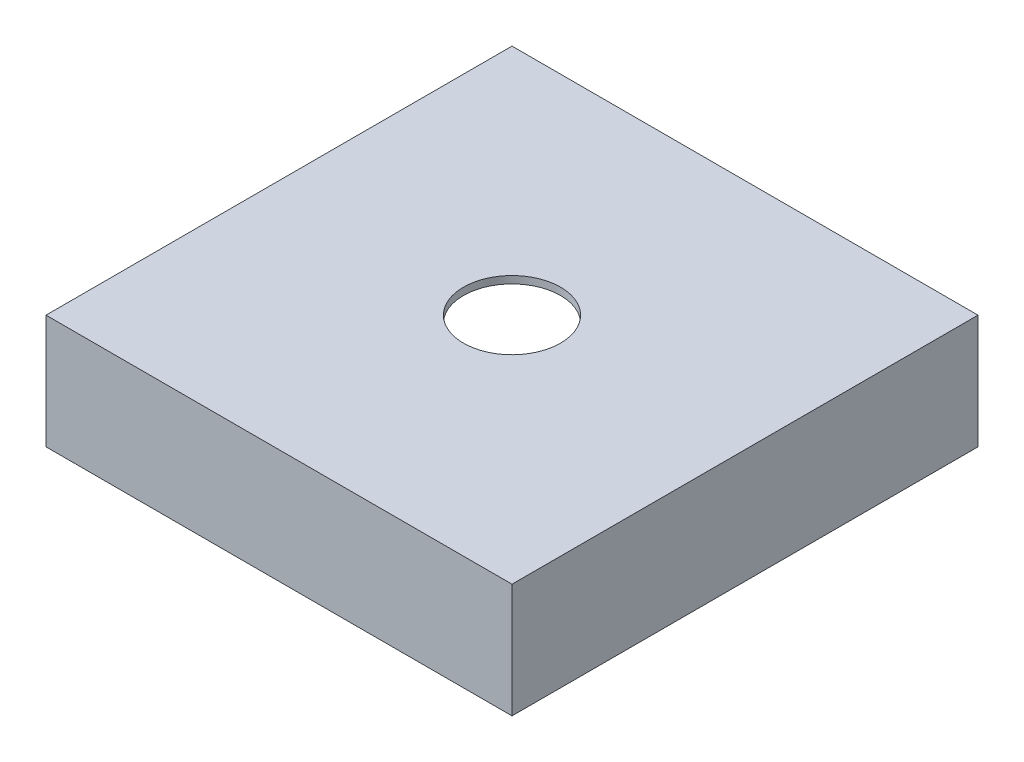
ISO-10303-21;
HEADER;
FILE_DESCRIPTION(('STEP AP214'),'2;1');
FILE_NAME('part.step','',(''),(''),'','','');
FILE_SCHEMA(('AUTOMOTIVE_DESIGN { 1 0 10303 214 1 1 1 1 }'));
ENDSEC;
DATA;
#1=APPLICATION_CONTEXT('core data for automotive mechanical design processes');
#2=APPLICATION_PROTOCOL_DEFINITION('international standard','automotive_design',2000,#1);
#3=PRODUCT_CONTEXT('',#1,'mechanical');
#4=PRODUCT('Part','Part','',(#3));
#5=PRODUCT_RELATED_PRODUCT_CATEGORY('part','',(#4));
#6=PRODUCT_DEFINITION_FORMATION('','',#4);
#7=PRODUCT_DEFINITION_CONTEXT('part definition',#1,'design');
#8=PRODUCT_DEFINITION('design','',#6,#7);
#9=PRODUCT_DEFINITION_SHAPE('','',#8);
#10=(LENGTH_UNIT() NAMED_UNIT(*) SI_UNIT(.MILLI.,.METRE.));
#11=(NAMED_UNIT(*) PLANE_ANGLE_UNIT() SI_UNIT($,.RADIAN.));
#12=(NAMED_UNIT(*) SI_UNIT($,.STERADIAN.) SOLID_ANGLE_UNIT());
#13=UNCERTAINTY_MEASURE_WITH_UNIT(LENGTH_MEASURE(1.E-05),#10,'distance_accuracy_value','');
#14=(GEOMETRIC_REPRESENTATION_CONTEXT(3) GLOBAL_UNCERTAINTY_ASSIGNED_CONTEXT((#13)) GLOBAL_UNIT_ASSIGNED_CONTEXT((#10,
#11,#12)) REPRESENTATION_CONTEXT('',''));
#15=CARTESIAN_POINT('',(0.,0.,0.));
#16=DIRECTION('',(0.,0.,1.));
#17=DIRECTION('',(1.,0.,0.));
#18=AXIS2_PLACEMENT_3D('',#15,#16,#17);
#19=CARTESIAN_POINT('',(0.,9.525,0.));
#20=DIRECTION('',(0.,1.,0.));
#21=DIRECTION('',(0.,0.,1.));
#22=AXIS2_PLACEMENT_3D('',#19,#20,#21);
#23=PLANE('',#22);
#24=DIRECTION('',(0.,0.,1.));
#25=VECTOR('',#24,1.);
#26=CARTESIAN_POINT('',(1589.69897269002,9.525,285.548674534386));
#27=LINE('',#26,#25);
#28=CARTESIAN_POINT('',(1589.69897269002,9.525,285.548674534386));
#29=VERTEX_POINT('',#28);
#30=CARTESIAN_POINT('',(1589.69897269002,9.525,895.148674534385));
#31=VERTEX_POINT('',#30);
#32=EDGE_CURVE('E160',#29,#31,#27,.T.);
#33=ORIENTED_EDGE('',*,*,#32,.T.);
#34=DIRECTION('',(1.,0.,0.));
#35=VECTOR('',#34,1.);
#36=CARTESIAN_POINT('',(1589.69897269002,9.525,895.148674534385));
#37=LINE('',#36,#35);
#38=CARTESIAN_POINT('',(2199.29897269002,9.525,895.148674534385));
#39=VERTEX_POINT('',#38);
#40=EDGE_CURVE('E165',#31,#39,#37,.T.);
#41=ORIENTED_EDGE('',*,*,#40,.T.);
#42=DIRECTION('',(0.,0.,-1.));
#43=VECTOR('',#42,1.);
#44=CARTESIAN_POINT('',(2199.29897269002,9.525,285.548674534386));
#45=LINE('',#44,#43);
#46=CARTESIAN_POINT('',(2199.29897269002,9.525,285.548674534386));
#47=VERTEX_POINT('',#46);
#48=EDGE_CURVE('E167',#39,#47,#45,.T.);
#49=ORIENTED_EDGE('',*,*,#48,.T.);
#50=DIRECTION('',(-1.,0.,0.));
#51=VECTOR('',#50,1.);
#52=CARTESIAN_POINT('',(1589.69897269002,9.525,285.548674534386));
#53=LINE('',#52,#51);
#54=EDGE_CURVE('E169',#47,#29,#53,.T.);
#55=ORIENTED_EDGE('',*,*,#54,.T.);
#56=EDGE_LOOP('',(#33,#41,#49,#55));
#57=FACE_BOUND('',#56,.T.);
#58=CARTESIAN_POINT('',(1894.49897269002,9.525,590.348674534386));
#59=DIRECTION('',(0.,1.,0.));
#60=DIRECTION('',(0.,0.,1.));
#61=AXIS2_PLACEMENT_3D('',#58,#59,#60);
#62=CIRCLE('',#61,63.4999999999998);
#63=CARTESIAN_POINT('',(1894.49897269002,9.525,526.848674534386));
#64=VERTEX_POINT('',#63);
#65=EDGE_CURVE('E157',#64,#64,#62,.T.);
#66=ORIENTED_EDGE('',*,*,#65,.F.);
#67=EDGE_LOOP('',(#66));
#68=FACE_BOUND('',#67,.T.);
#69=ADVANCED_FACE('F43',(#57,#68),#23,.T.);
#70=CARTESIAN_POINT('',(0.,0.,0.));
#71=DIRECTION('',(0.,1.,0.));
#72=DIRECTION('',(0.,0.,1.));
#73=AXIS2_PLACEMENT_3D('',#70,#71,#72);
#74=PLANE('',#73);
#75=DIRECTION('',(-1.,0.,0.));
#76=VECTOR('',#75,1.);
#77=CARTESIAN_POINT('',(3.77241165729674E-12,0.,323.648674534408));
#78=LINE('',#77,#76);
#79=CARTESIAN_POINT('',(2161.19897269002,0.,323.648674534383));
#80=VERTEX_POINT('',#79);
#81=CARTESIAN_POINT('',(1627.79897269002,0.,323.648674534386));
#82=VERTEX_POINT('',#81);
#83=EDGE_CURVE('E58',#80,#82,#78,.T.);
#84=ORIENTED_EDGE('',*,*,#83,.F.);
#85=DIRECTION('',(0.,0.,1.));
#86=VECTOR('',#85,1.);
#87=CARTESIAN_POINT('',(2161.19897269002,0.,-1.57441788732066E-11));
#88=LINE('',#87,#86);
#89=CARTESIAN_POINT('',(2161.19897269002,0.,857.048674534384));
#90=VERTEX_POINT('',#89);
#91=EDGE_CURVE('E111',#80,#90,#88,.T.);
#92=ORIENTED_EDGE('',*,*,#91,.T.);
#93=DIRECTION('',(1.,0.,0.));
#94=VECTOR('',#93,1.);
#95=CARTESIAN_POINT('',(3.32988686506581E-12,0.,857.048674534393));
#96=LINE('',#95,#94);
#97=CARTESIAN_POINT('',(1627.79897269002,0.,857.048674534386));
#98=VERTEX_POINT('',#97);
#99=EDGE_CURVE('E129',#98,#90,#96,.T.);
#100=ORIENTED_EDGE('',*,*,#99,.F.);
#101=DIRECTION('',(0.,0.,1.));
#102=VECTOR('',#101,1.);
#103=CARTESIAN_POINT('',(1627.79897269002,0.,0.));
#104=LINE('',#103,#102);
#105=EDGE_CURVE('E63',#82,#98,#104,.T.);
#106=ORIENTED_EDGE('',*,*,#105,.F.);
#107=EDGE_LOOP('',(#84,#92,#100,#106));
#108=FACE_BOUND('',#107,.T.);
#109=CARTESIAN_POINT('',(1894.49897269002,0.,590.348674534386));
#110=DIRECTION('',(0.,1.,0.));
#111=DIRECTION('',(0.,0.,1.));
#112=AXIS2_PLACEMENT_3D('',#109,#110,#111);
#113=CIRCLE('',#112,63.4999999999998);
#114=CARTESIAN_POINT('',(1894.49897269002,0.,526.848674534386));
#115=VERTEX_POINT('',#114);
#116=EDGE_CURVE('E113',#115,#115,#113,.T.);
#117=ORIENTED_EDGE('',*,*,#116,.T.);
#118=EDGE_LOOP('',(#117));
#119=FACE_BOUND('',#118,.T.);
#120=ADVANCED_FACE('F195',(#108,#119),#74,.F.);
#121=CARTESIAN_POINT('',(1589.69897269002,9.525,285.548674534386));
#122=DIRECTION('',(1.,0.,0.));
#123=DIRECTION('',(0.,0.,-1.));
#124=AXIS2_PLACEMENT_3D('',#121,#122,#123);
#125=PLANE('',#124);
#126=DIRECTION('',(0.,-1.,0.));
#127=VECTOR('',#126,1.);
#128=CARTESIAN_POINT('',(1589.69897269002,9.525,285.548674534386));
#129=LINE('',#128,#127);
#130=CARTESIAN_POINT('',(1589.69897269002,-139.7,285.548674534386));
#131=VERTEX_POINT('',#130);
#132=EDGE_CURVE('E171',#29,#131,#129,.T.);
#133=ORIENTED_EDGE('',*,*,#132,.T.);
#134=DIRECTION('',(0.,0.,-1.));
#135=VECTOR('',#134,1.);
#136=CARTESIAN_POINT('',(1589.69897269002,-139.7,0.));
#137=LINE('',#136,#135);
#138=CARTESIAN_POINT('',(1589.69897269002,-139.7,895.148674534385));
#139=VERTEX_POINT('',#138);
#140=EDGE_CURVE('E139',#139,#131,#137,.T.);
#141=ORIENTED_EDGE('',*,*,#140,.F.);
#142=DIRECTION('',(0.,-1.,0.));
#143=VECTOR('',#142,1.);
#144=CARTESIAN_POINT('',(1589.69897269002,9.525,895.148674534385));
#145=LINE('',#144,#143);
#146=EDGE_CURVE('E11',#31,#139,#145,.T.);
#147=ORIENTED_EDGE('',*,*,#146,.F.);
#148=ORIENTED_EDGE('',*,*,#32,.F.);
#149=EDGE_LOOP('',(#133,#141,#147,#148));
#150=FACE_BOUND('',#149,.T.);
#151=ADVANCED_FACE('F45',(#150),#125,.F.);
#152=CARTESIAN_POINT('',(1589.69897269002,9.525,895.148674534385));
#153=DIRECTION('',(0.,0.,-1.));
#154=DIRECTION('',(-1.,0.,0.));
#155=AXIS2_PLACEMENT_3D('',#152,#153,#154);
#156=PLANE('',#155);
#157=ORIENTED_EDGE('',*,*,#146,.T.);
#158=DIRECTION('',(-1.,0.,0.));
#159=VECTOR('',#158,1.);
#160=CARTESIAN_POINT('',(0.,-139.7,895.148674534385));
#161=LINE('',#160,#159);
#162=CARTESIAN_POINT('',(2199.29897269002,-139.7,895.148674534385));
#163=VERTEX_POINT('',#162);
#164=EDGE_CURVE('E136',#163,#139,#161,.T.);
#165=ORIENTED_EDGE('',*,*,#164,.F.);
#166=DIRECTION('',(0.,-1.,0.));
#167=VECTOR('',#166,1.);
#168=CARTESIAN_POINT('',(2199.29897269002,9.525,895.148674534385));
#169=LINE('',#168,#167);
#170=EDGE_CURVE('E51',#39,#163,#169,.T.);
#171=ORIENTED_EDGE('',*,*,#170,.F.);
#172=ORIENTED_EDGE('',*,*,#40,.F.);
#173=EDGE_LOOP('',(#157,#165,#171,#172));
#174=FACE_BOUND('',#173,.T.);
#175=ADVANCED_FACE('F183',(#174),#156,.F.);
#176=CARTESIAN_POINT('',(2199.29897269002,9.525,285.548674534386));
#177=DIRECTION('',(-1.,0.,0.));
#178=DIRECTION('',(0.,0.,1.));
#179=AXIS2_PLACEMENT_3D('',#176,#177,#178);
#180=PLANE('',#179);
#181=ORIENTED_EDGE('',*,*,#170,.T.);
#182=DIRECTION('',(0.,0.,1.));
#183=VECTOR('',#182,1.);
#184=CARTESIAN_POINT('',(2199.29897269002,-139.7,0.));
#185=LINE('',#184,#183);
#186=CARTESIAN_POINT('',(2199.29897269002,-139.7,285.548674534386));
#187=VERTEX_POINT('',#186);
#188=EDGE_CURVE('E145',#187,#163,#185,.T.);
#189=ORIENTED_EDGE('',*,*,#188,.F.);
#190=DIRECTION('',(0.,-1.,0.));
#191=VECTOR('',#190,1.);
#192=CARTESIAN_POINT('',(2199.29897269002,9.525,285.548674534386));
#193=LINE('',#192,#191);
#194=EDGE_CURVE('E173',#47,#187,#193,.T.);
#195=ORIENTED_EDGE('',*,*,#194,.F.);
#196=ORIENTED_EDGE('',*,*,#48,.F.);
#197=EDGE_LOOP('',(#181,#189,#195,#196));
#198=FACE_BOUND('',#197,.T.);
#199=ADVANCED_FACE('F178',(#198),#180,.F.);
#200=CARTESIAN_POINT('',(1589.69897269002,9.525,285.548674534386));
#201=DIRECTION('',(0.,0.,1.));
#202=DIRECTION('',(1.,0.,0.));
#203=AXIS2_PLACEMENT_3D('',#200,#201,#202);
#204=PLANE('',#203);
#205=ORIENTED_EDGE('',*,*,#194,.T.);
#206=DIRECTION('',(1.,0.,0.));
#207=VECTOR('',#206,1.);
#208=CARTESIAN_POINT('',(0.,-139.7,285.548674534386));
#209=LINE('',#208,#207);
#210=EDGE_CURVE('E142',#131,#187,#209,.T.);
#211=ORIENTED_EDGE('',*,*,#210,.F.);
#212=ORIENTED_EDGE('',*,*,#132,.F.);
#213=ORIENTED_EDGE('',*,*,#54,.F.);
#214=EDGE_LOOP('',(#205,#211,#212,#213));
#215=FACE_BOUND('',#214,.T.);
#216=ADVANCED_FACE('F190',(#215),#204,.F.);
#217=CARTESIAN_POINT('',(1894.49897269002,9.525,590.348674534386));
#218=DIRECTION('',(0.,-1.,0.));
#219=DIRECTION('',(0.,0.,-1.));
#220=AXIS2_PLACEMENT_3D('',#217,#218,#219);
#221=CYLINDRICAL_SURFACE('',#220,63.4999999999998);
#222=CARTESIAN_POINT('',(1894.49897269002,9.525,526.848674534386));
#223=CARTESIAN_POINT('',(1894.49897269002,9.42578125,526.848674534386));
#224=CARTESIAN_POINT('',(1894.49897269002,9.3265625,526.848674534386));
#225=CARTESIAN_POINT('',(1894.49897269002,9.128125,526.848674534386));
#226=CARTESIAN_POINT('',(1894.49897269002,9.02890625,526.848674534386));
#227=CARTESIAN_POINT('',(1894.49897269002,8.83046875,526.848674534386));
#228=CARTESIAN_POINT('',(1894.49897269002,8.73125,526.848674534386));
#229=CARTESIAN_POINT('',(1894.49897269002,8.5328125,526.848674534386));
#230=CARTESIAN_POINT('',(1894.49897269002,8.43359375,526.848674534386));
#231=CARTESIAN_POINT('',(1894.49897269002,8.23515625,526.848674534386));
#232=CARTESIAN_POINT('',(1894.49897269002,8.1359375,526.848674534386));
#233=CARTESIAN_POINT('',(1894.49897269002,7.9375,526.848674534386));
#234=CARTESIAN_POINT('',(1894.49897269002,7.83828125,526.848674534386));
#235=CARTESIAN_POINT('',(1894.49897269002,7.63984375,526.848674534386));
#236=CARTESIAN_POINT('',(1894.49897269002,7.540625,526.848674534386));
#237=CARTESIAN_POINT('',(1894.49897269002,7.3421875,526.848674534386));
#238=CARTESIAN_POINT('',(1894.49897269002,7.24296875,526.848674534386));
#239=CARTESIAN_POINT('',(1894.49897269002,7.04453125,526.848674534386));
#240=CARTESIAN_POINT('',(1894.49897269002,6.9453125,526.848674534386));
#241=CARTESIAN_POINT('',(1894.49897269002,6.746875,526.848674534386));
#242=CARTESIAN_POINT('',(1894.49897269002,6.64765625,526.848674534386));
#243=CARTESIAN_POINT('',(1894.49897269002,6.44921875,526.848674534386));
#244=CARTESIAN_POINT('',(1894.49897269002,6.35,526.848674534386));
#245=CARTESIAN_POINT('',(1894.49897269002,6.1515625,526.848674534386));
#246=CARTESIAN_POINT('',(1894.49897269002,6.05234375,526.848674534386));
#247=CARTESIAN_POINT('',(1894.49897269002,5.85390625,526.848674534386));
#248=CARTESIAN_POINT('',(1894.49897269002,5.7546875,526.848674534386));
#249=CARTESIAN_POINT('',(1894.49897269002,5.55625,526.848674534386));
#250=CARTESIAN_POINT('',(1894.49897269002,5.45703125,526.848674534386));
#251=CARTESIAN_POINT('',(1894.49897269002,5.25859375,526.848674534386));
#252=CARTESIAN_POINT('',(1894.49897269002,5.159375,526.848674534386));
#253=CARTESIAN_POINT('',(1894.49897269002,4.9609375,526.848674534386));
#254=CARTESIAN_POINT('',(1894.49897269002,4.86171875,526.848674534386));
#255=CARTESIAN_POINT('',(1894.49897269002,4.66328125,526.848674534386));
#256=CARTESIAN_POINT('',(1894.49897269002,4.5640625,526.848674534386));
#257=CARTESIAN_POINT('',(1894.49897269002,4.365625,526.848674534386));
#258=CARTESIAN_POINT('',(1894.49897269002,4.26640625,526.848674534386));
#259=CARTESIAN_POINT('',(1894.49897269002,4.06796875,526.848674534386));
#260=CARTESIAN_POINT('',(1894.49897269002,3.96875,526.848674534386));
#261=CARTESIAN_POINT('',(1894.49897269002,3.7703125,526.848674534386));
#262=CARTESIAN_POINT('',(1894.49897269002,3.67109375,526.848674534386));
#263=CARTESIAN_POINT('',(1894.49897269002,3.47265625,526.848674534386));
#264=CARTESIAN_POINT('',(1894.49897269002,3.3734375,526.848674534386));
#265=CARTESIAN_POINT('',(1894.49897269002,3.175,526.848674534386));
#266=CARTESIAN_POINT('',(1894.49897269002,3.07578125,526.848674534386));
#267=CARTESIAN_POINT('',(1894.49897269002,2.87734375,526.848674534386));
#268=CARTESIAN_POINT('',(1894.49897269002,2.778125,526.848674534386));
#269=CARTESIAN_POINT('',(1894.49897269002,2.5796875,526.848674534386));
#270=CARTESIAN_POINT('',(1894.49897269002,2.48046875,526.848674534386));
#271=CARTESIAN_POINT('',(1894.49897269002,2.28203125,526.848674534386));
#272=CARTESIAN_POINT('',(1894.49897269002,2.1828125,526.848674534386));
#273=CARTESIAN_POINT('',(1894.49897269002,1.984375,526.848674534386));
#274=CARTESIAN_POINT('',(1894.49897269002,1.88515625,526.848674534386));
#275=CARTESIAN_POINT('',(1894.49897269002,1.68671875,526.848674534386));
#276=CARTESIAN_POINT('',(1894.49897269002,1.5875,526.848674534386));
#277=CARTESIAN_POINT('',(1894.49897269002,1.3890625,526.848674534386));
#278=CARTESIAN_POINT('',(1894.49897269002,1.28984375,526.848674534386));
#279=CARTESIAN_POINT('',(1894.49897269002,1.09140625,526.848674534386));
#280=CARTESIAN_POINT('',(1894.49897269002,0.992187500000001,526.848674534386));
#281=CARTESIAN_POINT('',(1894.49897269002,0.793750000000001,526.848674534386));
#282=CARTESIAN_POINT('',(1894.49897269002,0.69453125,526.848674534386));
#283=CARTESIAN_POINT('',(1894.49897269002,0.49609375,526.848674534386));
#284=CARTESIAN_POINT('',(1894.49897269002,0.396875,526.848674534386));
#285=CARTESIAN_POINT('',(1894.49897269002,0.1984375,526.848674534386));
#286=CARTESIAN_POINT('',(1894.49897269002,0.0992187500000001,526.848674534386));
#287=CARTESIAN_POINT('',(1894.49897269002,0.,526.848674534386));
#288=B_SPLINE_CURVE_WITH_KNOTS('',3,(#222,#223,#224,#225,#226,#227,#228,#229,#230,#231,#232,
#233,#234,#235,#236,#237,#238,#239,#240,#241,#242,#243,#244,#245,#246,#247,#248,#249,#250,#251,
#252,#253,#254,#255,#256,#257,#258,#259,#260,#261,#262,#263,#264,#265,#266,#267,#268,#269,#270,
#271,#272,#273,#274,#275,#276,#277,#278,#279,#280,#281,#282,#283,#284,#285,#286,#287),
.UNSPECIFIED.,.F.,.F.,(4,2,2,2,2,2,2,2,2,2,2,2,2,2,2,2,2,2,2,2,2,2,2,2,2,2,2,2,2,2,2,2,4),(0.,
0.297656249999998,0.595312499999999,0.892968749999999,1.190625,1.48828125,1.7859375,2.08359375,
2.38125,2.67890625,2.9765625,3.27421875,3.571875,3.86953125,4.1671875,4.46484375,4.7625,
5.06015625,5.3578125,5.65546875,5.953125,6.25078125,6.5484375,6.84609375,7.14375,7.44140625,
7.7390625,8.03671875,8.334375,8.63203125,8.9296875,9.22734375,9.525),.UNSPECIFIED.);
#289=EDGE_CURVE('BSEAM199',#64,#115,#288,.T.);
#290=ORIENTED_EDGE('',*,*,#65,.T.);
#291=ORIENTED_EDGE('',*,*,#116,.F.);
#292=ORIENTED_EDGE('',*,*,#289,.T.);
#293=ORIENTED_EDGE('',*,*,#289,.F.);
#294=EDGE_LOOP('',(#290,#292,#291,#293));
#295=FACE_BOUND('',#294,.T.);
#296=ADVANCED_FACE('F199',(#295),#221,.F.);
#297=CARTESIAN_POINT('',(2161.19897269002,-139.7,-1.57441788732066E-11));
#298=DIRECTION('',(-1.,0.,0.));
#299=DIRECTION('',(0.,0.,1.));
#300=AXIS2_PLACEMENT_3D('',#297,#298,#299);
#301=PLANE('',#300);
#302=ORIENTED_EDGE('',*,*,#91,.F.);
#303=DIRECTION('',(0.,1.,0.));
#304=VECTOR('',#303,1.);
#305=CARTESIAN_POINT('',(2161.19897269002,-139.7,323.648674534383));
#306=LINE('',#305,#304);
#307=CARTESIAN_POINT('',(2161.19897269002,-139.7,323.648674534383));
#308=VERTEX_POINT('',#307);
#309=EDGE_CURVE('E105',#308,#80,#306,.T.);
#310=ORIENTED_EDGE('',*,*,#309,.F.);
#311=DIRECTION('',(0.,0.,1.));
#312=VECTOR('',#311,1.);
#313=CARTESIAN_POINT('',(2161.19897269002,-139.7,-1.57441788732066E-11));
#314=LINE('',#313,#312);
#315=CARTESIAN_POINT('',(2161.19897269002,-139.7,857.048674534384));
#316=VERTEX_POINT('',#315);
#317=EDGE_CURVE('E110',#308,#316,#314,.T.);
#318=ORIENTED_EDGE('',*,*,#317,.T.);
#319=DIRECTION('',(0.,1.,0.));
#320=VECTOR('',#319,1.);
#321=CARTESIAN_POINT('',(2161.19897269002,-139.7,857.048674534384));
#322=LINE('',#321,#320);
#323=EDGE_CURVE('E148',#316,#90,#322,.T.);
#324=ORIENTED_EDGE('',*,*,#323,.T.);
#325=EDGE_LOOP('',(#302,#310,#318,#324));
#326=FACE_BOUND('',#325,.T.);
#327=ADVANCED_FACE('F107',(#326),#301,.T.);
#328=CARTESIAN_POINT('',(3.77241165729674E-12,-139.7,323.648674534408));
#329=DIRECTION('',(0.,0.,-1.));
#330=DIRECTION('',(-1.,0.,0.));
#331=AXIS2_PLACEMENT_3D('',#328,#329,#330);
#332=PLANE('',#331);
#333=ORIENTED_EDGE('',*,*,#83,.T.);
#334=DIRECTION('',(0.,1.,0.));
#335=VECTOR('',#334,1.);
#336=CARTESIAN_POINT('',(1627.79897269002,-139.7,323.648674534386));
#337=LINE('',#336,#335);
#338=CARTESIAN_POINT('',(1627.79897269002,-139.7,323.648674534386));
#339=VERTEX_POINT('',#338);
#340=EDGE_CURVE('E114',#339,#82,#337,.T.);
#341=ORIENTED_EDGE('',*,*,#340,.F.);
#342=DIRECTION('',(-1.,0.,0.));
#343=VECTOR('',#342,1.);
#344=CARTESIAN_POINT('',(3.77241165729674E-12,-139.7,323.648674534408));
#345=LINE('',#344,#343);
#346=EDGE_CURVE('E117',#308,#339,#345,.T.);
#347=ORIENTED_EDGE('',*,*,#346,.F.);
#348=ORIENTED_EDGE('',*,*,#309,.T.);
#349=EDGE_LOOP('',(#333,#341,#347,#348));
#350=FACE_BOUND('',#349,.T.);
#351=ADVANCED_FACE('F118',(#350),#332,.F.);
#352=CARTESIAN_POINT('',(1627.79897269002,-139.7,0.));
#353=DIRECTION('',(-1.,0.,0.));
#354=DIRECTION('',(0.,0.,1.));
#355=AXIS2_PLACEMENT_3D('',#352,#353,#354);
#356=PLANE('',#355);
#357=ORIENTED_EDGE('',*,*,#105,.T.);
#358=DIRECTION('',(0.,1.,0.));
#359=VECTOR('',#358,1.);
#360=CARTESIAN_POINT('',(1627.79897269002,-139.7,857.048674534386));
#361=LINE('',#360,#359);
#362=CARTESIAN_POINT('',(1627.79897269002,-139.7,857.048674534386));
#363=VERTEX_POINT('',#362);
#364=EDGE_CURVE('E153',#363,#98,#361,.T.);
#365=ORIENTED_EDGE('',*,*,#364,.F.);
#366=DIRECTION('',(0.,0.,1.));
#367=VECTOR('',#366,1.);
#368=CARTESIAN_POINT('',(1627.79897269002,-139.7,0.));
#369=LINE('',#368,#367);
#370=EDGE_CURVE('E122',#339,#363,#369,.T.);
#371=ORIENTED_EDGE('',*,*,#370,.F.);
#372=ORIENTED_EDGE('',*,*,#340,.T.);
#373=EDGE_LOOP('',(#357,#365,#371,#372));
#374=FACE_BOUND('',#373,.T.);
#375=ADVANCED_FACE('F247',(#374),#356,.F.);
#376=CARTESIAN_POINT('',(3.32988686506581E-12,-139.7,857.048674534393));
#377=DIRECTION('',(0.,0.,1.));
#378=DIRECTION('',(1.,0.,0.));
#379=AXIS2_PLACEMENT_3D('',#376,#377,#378);
#380=PLANE('',#379);
#381=ORIENTED_EDGE('',*,*,#99,.T.);
#382=ORIENTED_EDGE('',*,*,#323,.F.);
#383=DIRECTION('',(1.,0.,0.));
#384=VECTOR('',#383,1.);
#385=CARTESIAN_POINT('',(3.32988686506581E-12,-139.7,857.048674534393));
#386=LINE('',#385,#384);
#387=EDGE_CURVE('E127',#363,#316,#386,.T.);
#388=ORIENTED_EDGE('',*,*,#387,.F.);
#389=ORIENTED_EDGE('',*,*,#364,.T.);
#390=EDGE_LOOP('',(#381,#382,#388,#389));
#391=FACE_BOUND('',#390,.T.);
#392=ADVANCED_FACE('F256',(#391),#380,.F.);
#393=CARTESIAN_POINT('',(0.,-139.7,0.));
#394=DIRECTION('',(0.,-1.,0.));
#395=DIRECTION('',(0.,0.,-1.));
#396=AXIS2_PLACEMENT_3D('',#393,#394,#395);
#397=PLANE('',#396);
#398=ORIENTED_EDGE('',*,*,#317,.F.);
#399=ORIENTED_EDGE('',*,*,#346,.T.);
#400=ORIENTED_EDGE('',*,*,#370,.T.);
#401=ORIENTED_EDGE('',*,*,#387,.T.);
#402=EDGE_LOOP('',(#398,#399,#400,#401));
#403=FACE_BOUND('',#402,.T.);
#404=ORIENTED_EDGE('',*,*,#164,.T.);
#405=ORIENTED_EDGE('',*,*,#140,.T.);
#406=ORIENTED_EDGE('',*,*,#210,.T.);
#407=ORIENTED_EDGE('',*,*,#188,.T.);
#408=EDGE_LOOP('',(#404,#405,#406,#407));
#409=FACE_BOUND('',#408,.T.);
#410=ADVANCED_FACE('F124',(#403,#409),#397,.T.);
#411=CLOSED_SHELL('',(#69,#120,#151,#175,#199,#216,#296,#327,#351,#375,#392,#410));
#412=MANIFOLD_SOLID_BREP('B2',#411);
#413=ADVANCED_BREP_SHAPE_REPRESENTATION('',(#18,#412),#14);
#414=SHAPE_DEFINITION_REPRESENTATION(#9,#413);
ENDSEC;
END-ISO-10303-21;
